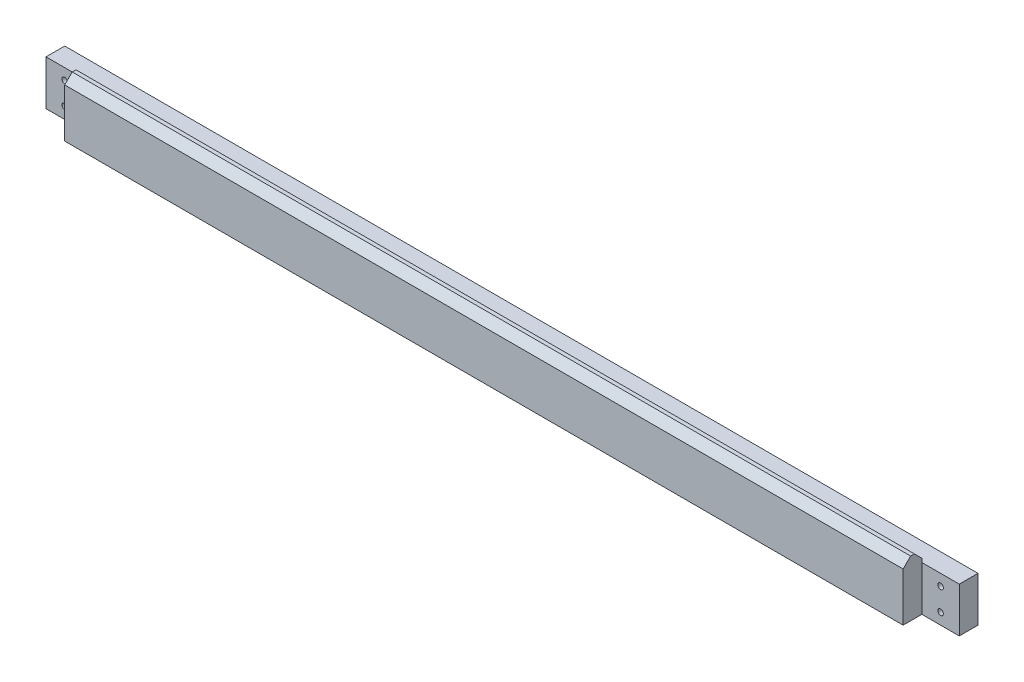
ISO-10303-21;
HEADER;
FILE_DESCRIPTION(('STEP AP214'),'2;1');
FILE_NAME('part.step','',(''),(''),'','','');
FILE_SCHEMA(('AUTOMOTIVE_DESIGN { 1 0 10303 214 1 1 1 1 }'));
ENDSEC;
DATA;
#1=APPLICATION_CONTEXT('core data for automotive mechanical design processes');
#2=APPLICATION_PROTOCOL_DEFINITION('international standard','automotive_design',2000,#1);
#3=PRODUCT_CONTEXT('',#1,'mechanical');
#4=PRODUCT('Part','Part','',(#3));
#5=PRODUCT_RELATED_PRODUCT_CATEGORY('part','',(#4));
#6=PRODUCT_DEFINITION_FORMATION('','',#4);
#7=PRODUCT_DEFINITION_CONTEXT('part definition',#1,'design');
#8=PRODUCT_DEFINITION('design','',#6,#7);
#9=PRODUCT_DEFINITION_SHAPE('','',#8);
#10=(LENGTH_UNIT() NAMED_UNIT(*) SI_UNIT(.MILLI.,.METRE.));
#11=(NAMED_UNIT(*) PLANE_ANGLE_UNIT() SI_UNIT($,.RADIAN.));
#12=(NAMED_UNIT(*) SI_UNIT($,.STERADIAN.) SOLID_ANGLE_UNIT());
#13=UNCERTAINTY_MEASURE_WITH_UNIT(LENGTH_MEASURE(1.E-05),#10,'distance_accuracy_value','');
#14=(GEOMETRIC_REPRESENTATION_CONTEXT(3) GLOBAL_UNCERTAINTY_ASSIGNED_CONTEXT((#13)) GLOBAL_UNIT_ASSIGNED_CONTEXT((#10,
#11,#12)) REPRESENTATION_CONTEXT('',''));
#15=CARTESIAN_POINT('',(0.,0.,0.));
#16=DIRECTION('',(0.,0.,1.));
#17=DIRECTION('',(1.,0.,0.));
#18=AXIS2_PLACEMENT_3D('',#15,#16,#17);
#19=CARTESIAN_POINT('',(0.,0.,31.75));
#20=DIRECTION('',(0.,0.,-1.));
#21=DIRECTION('',(-1.,0.,0.));
#22=AXIS2_PLACEMENT_3D('',#19,#20,#21);
#23=PLANE('',#22);
#24=CARTESIAN_POINT('',(-742.95,19.0500000000001,31.75));
#25=DIRECTION('',(0.,0.,-1.));
#26=DIRECTION('',(-1.,0.,0.));
#27=AXIS2_PLACEMENT_3D('',#24,#25,#26);
#28=CIRCLE('',#27,4.76250000000001);
#29=CARTESIAN_POINT('',(-747.7125,19.0500000000001,31.75));
#30=VERTEX_POINT('',#29);
#31=EDGE_CURVE('E159',#30,#30,#28,.T.);
#32=ORIENTED_EDGE('',*,*,#31,.T.);
#33=EDGE_LOOP('',(#32));
#34=FACE_BOUND('',#33,.T.);
#35=CARTESIAN_POINT('',(-742.95,-19.0500000000001,31.75));
#36=DIRECTION('',(0.,0.,-1.));
#37=DIRECTION('',(-1.,0.,0.));
#38=AXIS2_PLACEMENT_3D('',#35,#36,#37);
#39=CIRCLE('',#38,4.76250000000001);
#40=CARTESIAN_POINT('',(-747.7125,-19.0500000000001,31.75));
#41=VERTEX_POINT('',#40);
#42=EDGE_CURVE('E155',#41,#41,#39,.T.);
#43=ORIENTED_EDGE('',*,*,#42,.T.);
#44=EDGE_LOOP('',(#43));
#45=FACE_BOUND('',#44,.T.);
#46=DIRECTION('',(0.,-1.,0.));
#47=VECTOR('',#46,1.);
#48=CARTESIAN_POINT('',(-711.2,57.1499999999997,31.75));
#49=LINE('',#48,#47);
#50=CARTESIAN_POINT('',(-711.2,38.0999999999999,31.75));
#51=VERTEX_POINT('',#50);
#52=CARTESIAN_POINT('',(-711.2,-38.1000000000003,31.75));
#53=VERTEX_POINT('',#52);
#54=EDGE_CURVE('E133',#51,#53,#49,.T.);
#55=ORIENTED_EDGE('',*,*,#54,.F.);
#56=DIRECTION('',(-1.,0.,0.));
#57=VECTOR('',#56,1.);
#58=CARTESIAN_POINT('',(774.7,38.1000000000001,31.75));
#59=LINE('',#58,#57);
#60=CARTESIAN_POINT('',(-774.7,38.0999999999999,31.75));
#61=VERTEX_POINT('',#60);
#62=EDGE_CURVE('E189',#51,#61,#59,.T.);
#63=ORIENTED_EDGE('',*,*,#62,.T.);
#64=DIRECTION('',(0.,-1.,0.));
#65=VECTOR('',#64,1.);
#66=CARTESIAN_POINT('',(-774.7,38.0999999999999,31.75));
#67=LINE('',#66,#65);
#68=CARTESIAN_POINT('',(-774.7,-38.1000000000001,31.75));
#69=VERTEX_POINT('',#68);
#70=EDGE_CURVE('E180',#61,#69,#67,.T.);
#71=ORIENTED_EDGE('',*,*,#70,.T.);
#72=DIRECTION('',(1.,0.,0.));
#73=VECTOR('',#72,1.);
#74=CARTESIAN_POINT('',(774.7,-38.0999999999999,31.75));
#75=LINE('',#74,#73);
#76=EDGE_CURVE('E185',#69,#53,#75,.T.);
#77=ORIENTED_EDGE('',*,*,#76,.T.);
#78=EDGE_LOOP('',(#55,#63,#71,#77));
#79=FACE_BOUND('',#78,.T.);
#80=ADVANCED_FACE('F33',(#34,#45,#79),#23,.F.);
#81=CARTESIAN_POINT('',(-774.7,38.0999999999999,31.75));
#82=DIRECTION('',(1.,0.,0.));
#83=DIRECTION('',(0.,0.,-1.));
#84=AXIS2_PLACEMENT_3D('',#81,#82,#83);
#85=PLANE('',#84);
#86=DIRECTION('',(0.,-1.,0.));
#87=VECTOR('',#86,1.);
#88=CARTESIAN_POINT('',(-774.7,38.0999999999999,0.));
#89=LINE('',#88,#87);
#90=CARTESIAN_POINT('',(-774.7,38.0999999999999,0.));
#91=VERTEX_POINT('',#90);
#92=CARTESIAN_POINT('',(-774.7,-38.1000000000001,0.));
#93=VERTEX_POINT('',#92);
#94=EDGE_CURVE('E177',#91,#93,#89,.T.);
#95=ORIENTED_EDGE('',*,*,#94,.T.);
#96=DIRECTION('',(0.,0.,-1.));
#97=VECTOR('',#96,1.);
#98=CARTESIAN_POINT('',(-774.7,-38.1000000000001,31.75));
#99=LINE('',#98,#97);
#100=EDGE_CURVE('E210',#69,#93,#99,.T.);
#101=ORIENTED_EDGE('',*,*,#100,.F.);
#102=ORIENTED_EDGE('',*,*,#70,.F.);
#103=DIRECTION('',(0.,0.,-1.));
#104=VECTOR('',#103,1.);
#105=CARTESIAN_POINT('',(-774.7,38.0999999999999,31.75));
#106=LINE('',#105,#104);
#107=EDGE_CURVE('E193',#61,#91,#106,.T.);
#108=ORIENTED_EDGE('',*,*,#107,.T.);
#109=EDGE_LOOP('',(#95,#101,#102,#108));
#110=FACE_BOUND('',#109,.T.);
#111=ADVANCED_FACE('F247',(#110),#85,.F.);
#112=CARTESIAN_POINT('',(774.7,-38.0999999999999,31.75));
#113=DIRECTION('',(0.,1.,0.));
#114=DIRECTION('',(-1.,0.,0.));
#115=AXIS2_PLACEMENT_3D('',#112,#113,#114);
#116=PLANE('',#115);
#117=DIRECTION('',(1.,0.,0.));
#118=VECTOR('',#117,1.);
#119=CARTESIAN_POINT('',(774.7,-38.0999999999999,0.));
#120=LINE('',#119,#118);
#121=CARTESIAN_POINT('',(774.7,-38.0999999999999,0.));
#122=VERTEX_POINT('',#121);
#123=EDGE_CURVE('E197',#93,#122,#120,.T.);
#124=ORIENTED_EDGE('',*,*,#123,.T.);
#125=DIRECTION('',(0.,0.,-1.));
#126=VECTOR('',#125,1.);
#127=CARTESIAN_POINT('',(774.7,-38.0999999999999,31.75));
#128=LINE('',#127,#126);
#129=CARTESIAN_POINT('',(774.7,-38.0999999999999,31.75));
#130=VERTEX_POINT('',#129);
#131=EDGE_CURVE('E207',#130,#122,#128,.T.);
#132=ORIENTED_EDGE('',*,*,#131,.F.);
#133=CARTESIAN_POINT('',(711.2,-38.0999999999999,31.75));
#134=VERTEX_POINT('',#133);
#135=EDGE_CURVE('E183',#134,#130,#75,.T.);
#136=ORIENTED_EDGE('',*,*,#135,.F.);
#137=DIRECTION('',(0.,0.,-1.));
#138=VECTOR('',#137,1.);
#139=CARTESIAN_POINT('',(711.2,-38.1000000000001,63.5));
#140=LINE('',#139,#138);
#141=CARTESIAN_POINT('',(711.2,-38.1000000000001,63.5));
#142=VERTEX_POINT('',#141);
#143=EDGE_CURVE('E136',#142,#134,#140,.T.);
#144=ORIENTED_EDGE('',*,*,#143,.F.);
#145=DIRECTION('',(-1.,0.,0.));
#146=VECTOR('',#145,1.);
#147=CARTESIAN_POINT('',(711.2,-38.1000000000001,63.5));
#148=LINE('',#147,#146);
#149=CARTESIAN_POINT('',(-711.2,-38.1000000000003,63.5));
#150=VERTEX_POINT('',#149);
#151=EDGE_CURVE('E122',#142,#150,#148,.T.);
#152=ORIENTED_EDGE('',*,*,#151,.T.);
#153=DIRECTION('',(0.,0.,-1.));
#154=VECTOR('',#153,1.);
#155=CARTESIAN_POINT('',(-711.2,-38.1000000000003,63.5));
#156=LINE('',#155,#154);
#157=EDGE_CURVE('E129',#150,#53,#156,.T.);
#158=ORIENTED_EDGE('',*,*,#157,.T.);
#159=ORIENTED_EDGE('',*,*,#76,.F.);
#160=ORIENTED_EDGE('',*,*,#100,.T.);
#161=EDGE_LOOP('',(#124,#132,#136,#144,#152,#158,#159,#160));
#162=FACE_BOUND('',#161,.T.);
#163=ADVANCED_FACE('F139',(#162),#116,.F.);
#164=CARTESIAN_POINT('',(774.7,38.1000000000001,31.75));
#165=DIRECTION('',(-1.,0.,0.));
#166=DIRECTION('',(0.,0.,1.));
#167=AXIS2_PLACEMENT_3D('',#164,#165,#166);
#168=PLANE('',#167);
#169=DIRECTION('',(0.,1.,0.));
#170=VECTOR('',#169,1.);
#171=CARTESIAN_POINT('',(774.7,38.1000000000001,0.));
#172=LINE('',#171,#170);
#173=CARTESIAN_POINT('',(774.7,38.1000000000001,0.));
#174=VERTEX_POINT('',#173);
#175=EDGE_CURVE('E199',#122,#174,#172,.T.);
#176=ORIENTED_EDGE('',*,*,#175,.T.);
#177=DIRECTION('',(0.,0.,-1.));
#178=VECTOR('',#177,1.);
#179=CARTESIAN_POINT('',(774.7,38.1000000000001,31.75));
#180=LINE('',#179,#178);
#181=CARTESIAN_POINT('',(774.7,38.1000000000001,31.75));
#182=VERTEX_POINT('',#181);
#183=EDGE_CURVE('E204',#182,#174,#180,.T.);
#184=ORIENTED_EDGE('',*,*,#183,.F.);
#185=DIRECTION('',(0.,1.,0.));
#186=VECTOR('',#185,1.);
#187=CARTESIAN_POINT('',(774.7,38.1000000000001,31.75));
#188=LINE('',#187,#186);
#189=EDGE_CURVE('E187',#130,#182,#188,.T.);
#190=ORIENTED_EDGE('',*,*,#189,.F.);
#191=ORIENTED_EDGE('',*,*,#131,.T.);
#192=EDGE_LOOP('',(#176,#184,#190,#191));
#193=FACE_BOUND('',#192,.T.);
#194=ADVANCED_FACE('F253',(#193),#168,.F.);
#195=CARTESIAN_POINT('',(774.7,38.1000000000001,31.75));
#196=DIRECTION('',(0.,-1.,0.));
#197=DIRECTION('',(1.,0.,0.));
#198=AXIS2_PLACEMENT_3D('',#195,#196,#197);
#199=PLANE('',#198);
#200=DIRECTION('',(-1.,0.,0.));
#201=VECTOR('',#200,1.);
#202=CARTESIAN_POINT('',(774.7,38.1000000000001,0.));
#203=LINE('',#202,#201);
#204=EDGE_CURVE('E184',#174,#91,#203,.T.);
#205=ORIENTED_EDGE('',*,*,#204,.T.);
#206=ORIENTED_EDGE('',*,*,#107,.F.);
#207=ORIENTED_EDGE('',*,*,#62,.F.);
#208=CARTESIAN_POINT('',(711.2,38.1000000000001,31.75));
#209=VERTEX_POINT('',#208);
#210=EDGE_CURVE('E194',#209,#51,#59,.T.);
#211=ORIENTED_EDGE('',*,*,#210,.F.);
#212=EDGE_CURVE('E190',#182,#209,#59,.T.);
#213=ORIENTED_EDGE('',*,*,#212,.F.);
#214=ORIENTED_EDGE('',*,*,#183,.T.);
#215=EDGE_LOOP('',(#205,#206,#207,#211,#213,#214));
#216=FACE_BOUND('',#215,.T.);
#217=ADVANCED_FACE('F243',(#216),#199,.F.);
#218=CARTESIAN_POINT('',(742.95,-19.0500000000001,31.75));
#219=DIRECTION('',(0.,0.,1.));
#220=DIRECTION('',(1.,0.,0.));
#221=AXIS2_PLACEMENT_3D('',#218,#219,#220);
#222=CIRCLE('',#221,4.76250000000001);
#223=CARTESIAN_POINT('',(747.7125,-19.0500000000001,31.75));
#224=VERTEX_POINT('',#223);
#225=EDGE_CURVE('E165',#224,#224,#222,.T.);
#226=ORIENTED_EDGE('',*,*,#225,.F.);
#227=EDGE_LOOP('',(#226));
#228=FACE_BOUND('',#227,.T.);
#229=CARTESIAN_POINT('',(742.95,19.0500000000001,31.75));
#230=DIRECTION('',(0.,0.,1.));
#231=DIRECTION('',(1.,0.,0.));
#232=AXIS2_PLACEMENT_3D('',#229,#230,#231);
#233=CIRCLE('',#232,4.76250000000001);
#234=CARTESIAN_POINT('',(747.7125,19.0500000000001,31.75));
#235=VERTEX_POINT('',#234);
#236=EDGE_CURVE('E171',#235,#235,#233,.T.);
#237=ORIENTED_EDGE('',*,*,#236,.F.);
#238=EDGE_LOOP('',(#237));
#239=FACE_BOUND('',#238,.T.);
#240=ORIENTED_EDGE('',*,*,#212,.T.);
#241=DIRECTION('',(0.,-1.,0.));
#242=VECTOR('',#241,1.);
#243=CARTESIAN_POINT('',(711.2,57.1499999999999,31.75));
#244=LINE('',#243,#242);
#245=EDGE_CURVE('E150',#209,#134,#244,.T.);
#246=ORIENTED_EDGE('',*,*,#245,.T.);
#247=ORIENTED_EDGE('',*,*,#135,.T.);
#248=ORIENTED_EDGE('',*,*,#189,.T.);
#249=EDGE_LOOP('',(#240,#246,#247,#248));
#250=FACE_BOUND('',#249,.T.);
#251=ADVANCED_FACE('F258',(#228,#239,#250),#23,.F.);
#252=CARTESIAN_POINT('',(0.,0.,0.));
#253=DIRECTION('',(0.,0.,-1.));
#254=DIRECTION('',(-1.,0.,0.));
#255=AXIS2_PLACEMENT_3D('',#252,#253,#254);
#256=PLANE('',#255);
#257=CARTESIAN_POINT('',(-742.95,-19.0500000000001,0.));
#258=DIRECTION('',(0.,0.,-1.));
#259=DIRECTION('',(-1.,0.,0.));
#260=AXIS2_PLACEMENT_3D('',#257,#258,#259);
#261=CIRCLE('',#260,4.76250000000001);
#262=CARTESIAN_POINT('',(-747.7125,-19.0500000000001,0.));
#263=VERTEX_POINT('',#262);
#264=EDGE_CURVE('E156',#263,#263,#261,.T.);
#265=ORIENTED_EDGE('',*,*,#264,.F.);
#266=EDGE_LOOP('',(#265));
#267=FACE_BOUND('',#266,.T.);
#268=CARTESIAN_POINT('',(-742.95,19.0500000000001,0.));
#269=DIRECTION('',(0.,0.,-1.));
#270=DIRECTION('',(-1.,0.,0.));
#271=AXIS2_PLACEMENT_3D('',#268,#269,#270);
#272=CIRCLE('',#271,4.76250000000001);
#273=CARTESIAN_POINT('',(-747.7125,19.0500000000001,0.));
#274=VERTEX_POINT('',#273);
#275=EDGE_CURVE('E162',#274,#274,#272,.T.);
#276=ORIENTED_EDGE('',*,*,#275,.F.);
#277=EDGE_LOOP('',(#276));
#278=FACE_BOUND('',#277,.T.);
#279=CARTESIAN_POINT('',(742.95,-19.0500000000001,0.));
#280=DIRECTION('',(0.,0.,1.));
#281=DIRECTION('',(1.,0.,0.));
#282=AXIS2_PLACEMENT_3D('',#279,#280,#281);
#283=CIRCLE('',#282,4.76250000000001);
#284=CARTESIAN_POINT('',(747.7125,-19.0500000000001,0.));
#285=VERTEX_POINT('',#284);
#286=EDGE_CURVE('E168',#285,#285,#283,.T.);
#287=ORIENTED_EDGE('',*,*,#286,.T.);
#288=EDGE_LOOP('',(#287));
#289=FACE_BOUND('',#288,.T.);
#290=CARTESIAN_POINT('',(742.95,19.0500000000001,0.));
#291=DIRECTION('',(0.,0.,1.));
#292=DIRECTION('',(1.,0.,0.));
#293=AXIS2_PLACEMENT_3D('',#290,#291,#292);
#294=CIRCLE('',#293,4.76250000000001);
#295=CARTESIAN_POINT('',(747.7125,19.0500000000001,0.));
#296=VERTEX_POINT('',#295);
#297=EDGE_CURVE('E174',#296,#296,#294,.T.);
#298=ORIENTED_EDGE('',*,*,#297,.T.);
#299=EDGE_LOOP('',(#298));
#300=FACE_BOUND('',#299,.T.);
#301=ORIENTED_EDGE('',*,*,#94,.F.);
#302=ORIENTED_EDGE('',*,*,#204,.F.);
#303=ORIENTED_EDGE('',*,*,#175,.F.);
#304=ORIENTED_EDGE('',*,*,#123,.F.);
#305=EDGE_LOOP('',(#301,#302,#303,#304));
#306=FACE_BOUND('',#305,.T.);
#307=ADVANCED_FACE('F255',(#267,#278,#289,#300,#306),#256,.T.);
#308=CARTESIAN_POINT('',(742.95,19.0500000000001,0.));
#309=DIRECTION('',(0.,0.,1.));
#310=DIRECTION('',(1.,0.,0.));
#311=AXIS2_PLACEMENT_3D('',#308,#309,#310);
#312=CYLINDRICAL_SURFACE('',#311,4.76250000000001);
#313=ORIENTED_EDGE('',*,*,#297,.F.);
#314=EDGE_LOOP('',(#313));
#315=FACE_BOUND('',#314,.T.);
#316=ORIENTED_EDGE('',*,*,#236,.T.);
#317=EDGE_LOOP('',(#316));
#318=FACE_BOUND('',#317,.T.);
#319=ADVANCED_FACE('F257',(#315,#318),#312,.F.);
#320=CARTESIAN_POINT('',(742.95,-19.0500000000001,0.));
#321=DIRECTION('',(0.,0.,1.));
#322=DIRECTION('',(1.,0.,0.));
#323=AXIS2_PLACEMENT_3D('',#320,#321,#322);
#324=CYLINDRICAL_SURFACE('',#323,4.76250000000001);
#325=ORIENTED_EDGE('',*,*,#286,.F.);
#326=EDGE_LOOP('',(#325));
#327=FACE_BOUND('',#326,.T.);
#328=ORIENTED_EDGE('',*,*,#225,.T.);
#329=EDGE_LOOP('',(#328));
#330=FACE_BOUND('',#329,.T.);
#331=ADVANCED_FACE('F265',(#327,#330),#324,.F.);
#332=CARTESIAN_POINT('',(-742.95,19.0500000000001,0.));
#333=DIRECTION('',(0.,0.,1.));
#334=DIRECTION('',(1.,0.,0.));
#335=AXIS2_PLACEMENT_3D('',#332,#333,#334);
#336=CYLINDRICAL_SURFACE('',#335,4.76250000000001);
#337=ORIENTED_EDGE('',*,*,#275,.T.);
#338=EDGE_LOOP('',(#337));
#339=FACE_BOUND('',#338,.T.);
#340=ORIENTED_EDGE('',*,*,#31,.F.);
#341=EDGE_LOOP('',(#340));
#342=FACE_BOUND('',#341,.T.);
#343=ADVANCED_FACE('F283',(#339,#342),#336,.F.);
#344=CARTESIAN_POINT('',(-742.95,-19.0500000000001,0.));
#345=DIRECTION('',(0.,0.,1.));
#346=DIRECTION('',(1.,0.,0.));
#347=AXIS2_PLACEMENT_3D('',#344,#345,#346);
#348=CYLINDRICAL_SURFACE('',#347,4.76250000000001);
#349=ORIENTED_EDGE('',*,*,#264,.T.);
#350=EDGE_LOOP('',(#349));
#351=FACE_BOUND('',#350,.T.);
#352=ORIENTED_EDGE('',*,*,#42,.F.);
#353=EDGE_LOOP('',(#352));
#354=FACE_BOUND('',#353,.T.);
#355=ADVANCED_FACE('F287',(#351,#354),#348,.F.);
#356=CARTESIAN_POINT('',(0.,0.,31.75));
#357=DIRECTION('',(0.,0.,1.));
#358=DIRECTION('',(1.,0.,0.));
#359=AXIS2_PLACEMENT_3D('',#356,#357,#358);
#360=PLANE('',#359);
#361=CARTESIAN_POINT('',(-711.2,44.45,31.75));
#362=VERTEX_POINT('',#361);
#363=EDGE_CURVE('E147',#362,#51,#49,.T.);
#364=ORIENTED_EDGE('',*,*,#363,.F.);
#365=DIRECTION('',(1.,0.,0.));
#366=VECTOR('',#365,1.);
#367=CARTESIAN_POINT('',(0.,44.4500000000001,31.75));
#368=LINE('',#367,#366);
#369=CARTESIAN_POINT('',(711.2,44.4500000000002,31.75));
#370=VERTEX_POINT('',#369);
#371=EDGE_CURVE('E56',#362,#370,#368,.T.);
#372=ORIENTED_EDGE('',*,*,#371,.T.);
#373=EDGE_CURVE('E125',#370,#209,#244,.T.);
#374=ORIENTED_EDGE('',*,*,#373,.T.);
#375=ORIENTED_EDGE('',*,*,#210,.T.);
#376=EDGE_LOOP('',(#364,#372,#374,#375));
#377=FACE_BOUND('',#376,.T.);
#378=ADVANCED_FACE('F234',(#377),#360,.F.);
#379=CARTESIAN_POINT('',(711.2,57.1499999999999,63.5));
#380=DIRECTION('',(0.,-1.,0.));
#381=DIRECTION('',(1.,0.,0.));
#382=AXIS2_PLACEMENT_3D('',#379,#380,#381);
#383=PLANE('',#382);
#384=DIRECTION('',(0.,0.,-1.));
#385=VECTOR('',#384,1.);
#386=CARTESIAN_POINT('',(711.2,57.1499999999999,63.5));
#387=LINE('',#386,#385);
#388=CARTESIAN_POINT('',(711.2,57.1499999999999,50.8000000000003));
#389=VERTEX_POINT('',#388);
#390=CARTESIAN_POINT('',(711.2,57.1499999999999,44.4499999999999));
#391=VERTEX_POINT('',#390);
#392=EDGE_CURVE('E144',#389,#391,#387,.T.);
#393=ORIENTED_EDGE('',*,*,#392,.T.);
#394=DIRECTION('',(-1.,0.,0.));
#395=VECTOR('',#394,1.);
#396=CARTESIAN_POINT('',(711.2,57.1499999999999,44.4499999999999));
#397=LINE('',#396,#395);
#398=CARTESIAN_POINT('',(-711.2,57.1499999999997,44.4499999999999));
#399=VERTEX_POINT('',#398);
#400=EDGE_CURVE('E215',#391,#399,#397,.T.);
#401=ORIENTED_EDGE('',*,*,#400,.T.);
#402=DIRECTION('',(0.,0.,-1.));
#403=VECTOR('',#402,1.);
#404=CARTESIAN_POINT('',(-711.2,57.1499999999997,63.5));
#405=LINE('',#404,#403);
#406=CARTESIAN_POINT('',(-711.2,57.1499999999997,50.8000000000003));
#407=VERTEX_POINT('',#406);
#408=EDGE_CURVE('E135',#407,#399,#405,.T.);
#409=ORIENTED_EDGE('',*,*,#408,.F.);
#410=DIRECTION('',(1.,0.,0.));
#411=VECTOR('',#410,1.);
#412=CARTESIAN_POINT('',(711.2,57.1499999999999,50.8000000000003));
#413=LINE('',#412,#411);
#414=EDGE_CURVE('E213',#407,#389,#413,.T.);
#415=ORIENTED_EDGE('',*,*,#414,.T.);
#416=EDGE_LOOP('',(#393,#401,#409,#415));
#417=FACE_BOUND('',#416,.T.);
#418=ADVANCED_FACE('F229',(#417),#383,.F.);
#419=CARTESIAN_POINT('',(-711.2,57.1499999999997,63.5));
#420=DIRECTION('',(1.,0.,0.));
#421=DIRECTION('',(0.,0.,-1.));
#422=AXIS2_PLACEMENT_3D('',#419,#420,#421);
#423=PLANE('',#422);
#424=ORIENTED_EDGE('',*,*,#408,.T.);
#425=DIRECTION('',(0.,0.707106781186541,0.707106781186554));
#426=VECTOR('',#425,1.);
#427=CARTESIAN_POINT('',(-711.2,57.1499999999998,44.45));
#428=LINE('',#427,#426);
#429=EDGE_CURVE('E220',#399,#362,#428,.F.);
#430=ORIENTED_EDGE('',*,*,#429,.T.);
#431=ORIENTED_EDGE('',*,*,#363,.T.);
#432=ORIENTED_EDGE('',*,*,#54,.T.);
#433=ORIENTED_EDGE('',*,*,#157,.F.);
#434=DIRECTION('',(0.,-1.,0.));
#435=VECTOR('',#434,1.);
#436=CARTESIAN_POINT('',(-711.2,57.1499999999997,63.5));
#437=LINE('',#436,#435);
#438=CARTESIAN_POINT('',(-711.2,44.4499999999998,63.5));
#439=VERTEX_POINT('',#438);
#440=EDGE_CURVE('E118',#439,#150,#437,.T.);
#441=ORIENTED_EDGE('',*,*,#440,.F.);
#442=DIRECTION('',(0.,0.707106781186554,-0.707106781186541));
#443=VECTOR('',#442,1.);
#444=CARTESIAN_POINT('',(-711.2,44.4499999999999,63.5));
#445=LINE('',#444,#443);
#446=EDGE_CURVE('E218',#439,#407,#445,.T.);
#447=ORIENTED_EDGE('',*,*,#446,.T.);
#448=EDGE_LOOP('',(#424,#430,#431,#432,#433,#441,#447));
#449=FACE_BOUND('',#448,.T.);
#450=ADVANCED_FACE('F131',(#449),#423,.F.);
#451=CARTESIAN_POINT('',(711.2,57.1499999999999,63.5));
#452=DIRECTION('',(1.,0.,0.));
#453=DIRECTION('',(0.,0.,-1.));
#454=AXIS2_PLACEMENT_3D('',#451,#452,#453);
#455=PLANE('',#454);
#456=ORIENTED_EDGE('',*,*,#373,.F.);
#457=DIRECTION('',(0.,-0.707106781186541,-0.707106781186554));
#458=VECTOR('',#457,1.);
#459=CARTESIAN_POINT('',(711.2,66.6749999999999,53.9750000000001));
#460=LINE('',#459,#458);
#461=EDGE_CURVE('E41',#370,#391,#460,.F.);
#462=ORIENTED_EDGE('',*,*,#461,.T.);
#463=ORIENTED_EDGE('',*,*,#392,.F.);
#464=DIRECTION('',(0.,-0.707106781186554,0.707106781186541));
#465=VECTOR('',#464,1.);
#466=CARTESIAN_POINT('',(711.2,50.8000000000001,57.15));
#467=LINE('',#466,#465);
#468=CARTESIAN_POINT('',(711.2,44.45,63.5));
#469=VERTEX_POINT('',#468);
#470=EDGE_CURVE('E48',#389,#469,#467,.T.);
#471=ORIENTED_EDGE('',*,*,#470,.T.);
#472=DIRECTION('',(0.,-1.,0.));
#473=VECTOR('',#472,1.);
#474=CARTESIAN_POINT('',(711.2,57.1499999999999,63.5));
#475=LINE('',#474,#473);
#476=EDGE_CURVE('E142',#469,#142,#475,.T.);
#477=ORIENTED_EDGE('',*,*,#476,.T.);
#478=ORIENTED_EDGE('',*,*,#143,.T.);
#479=ORIENTED_EDGE('',*,*,#245,.F.);
#480=EDGE_LOOP('',(#456,#462,#463,#471,#477,#478,#479));
#481=FACE_BOUND('',#480,.T.);
#482=ADVANCED_FACE('F224',(#481),#455,.T.);
#483=CARTESIAN_POINT('',(0.,0.,63.5));
#484=DIRECTION('',(0.,0.,1.));
#485=DIRECTION('',(1.,0.,0.));
#486=AXIS2_PLACEMENT_3D('',#483,#484,#485);
#487=PLANE('',#486);
#488=ORIENTED_EDGE('',*,*,#476,.F.);
#489=DIRECTION('',(-1.,0.,0.));
#490=VECTOR('',#489,1.);
#491=CARTESIAN_POINT('',(-711.2,44.4499999999998,63.5));
#492=LINE('',#491,#490);
#493=EDGE_CURVE('E11',#469,#439,#492,.T.);
#494=ORIENTED_EDGE('',*,*,#493,.T.);
#495=ORIENTED_EDGE('',*,*,#440,.T.);
#496=ORIENTED_EDGE('',*,*,#151,.F.);
#497=EDGE_LOOP('',(#488,#494,#495,#496));
#498=FACE_BOUND('',#497,.T.);
#499=ADVANCED_FACE('F120',(#498),#487,.T.);
#500=CARTESIAN_POINT('',(711.2,57.1499999999999,44.4499999999999));
#501=DIRECTION('',(0.,-0.707106781186554,0.707106781186541));
#502=DIRECTION('',(-1.,0.,0.));
#503=AXIS2_PLACEMENT_3D('',#500,#501,#502);
#504=PLANE('',#503);
#505=ORIENTED_EDGE('',*,*,#461,.F.);
#506=ORIENTED_EDGE('',*,*,#371,.F.);
#507=ORIENTED_EDGE('',*,*,#429,.F.);
#508=ORIENTED_EDGE('',*,*,#400,.F.);
#509=EDGE_LOOP('',(#505,#506,#507,#508));
#510=FACE_BOUND('',#509,.T.);
#511=ADVANCED_FACE('F232',(#510),#504,.F.);
#512=CARTESIAN_POINT('',(0.,44.4499999999999,63.5));
#513=DIRECTION('',(0.,0.707106781186541,0.707106781186554));
#514=DIRECTION('',(1.,0.,0.));
#515=AXIS2_PLACEMENT_3D('',#512,#513,#514);
#516=PLANE('',#515);
#517=ORIENTED_EDGE('',*,*,#470,.F.);
#518=ORIENTED_EDGE('',*,*,#414,.F.);
#519=ORIENTED_EDGE('',*,*,#446,.F.);
#520=ORIENTED_EDGE('',*,*,#493,.F.);
#521=EDGE_LOOP('',(#517,#518,#519,#520));
#522=FACE_BOUND('',#521,.T.);
#523=ADVANCED_FACE('F35',(#522),#516,.T.);
#524=CLOSED_SHELL('',(#80,#111,#163,#194,#217,#251,#307,#319,#331,#343,#355,#378,#418,#450,#482,
#499,#511,#523));
#525=MANIFOLD_SOLID_BREP('B2',#524);
#526=ADVANCED_BREP_SHAPE_REPRESENTATION('',(#18,#525),#14);
#527=SHAPE_DEFINITION_REPRESENTATION(#9,#526);
ENDSEC;
END-ISO-10303-21;
